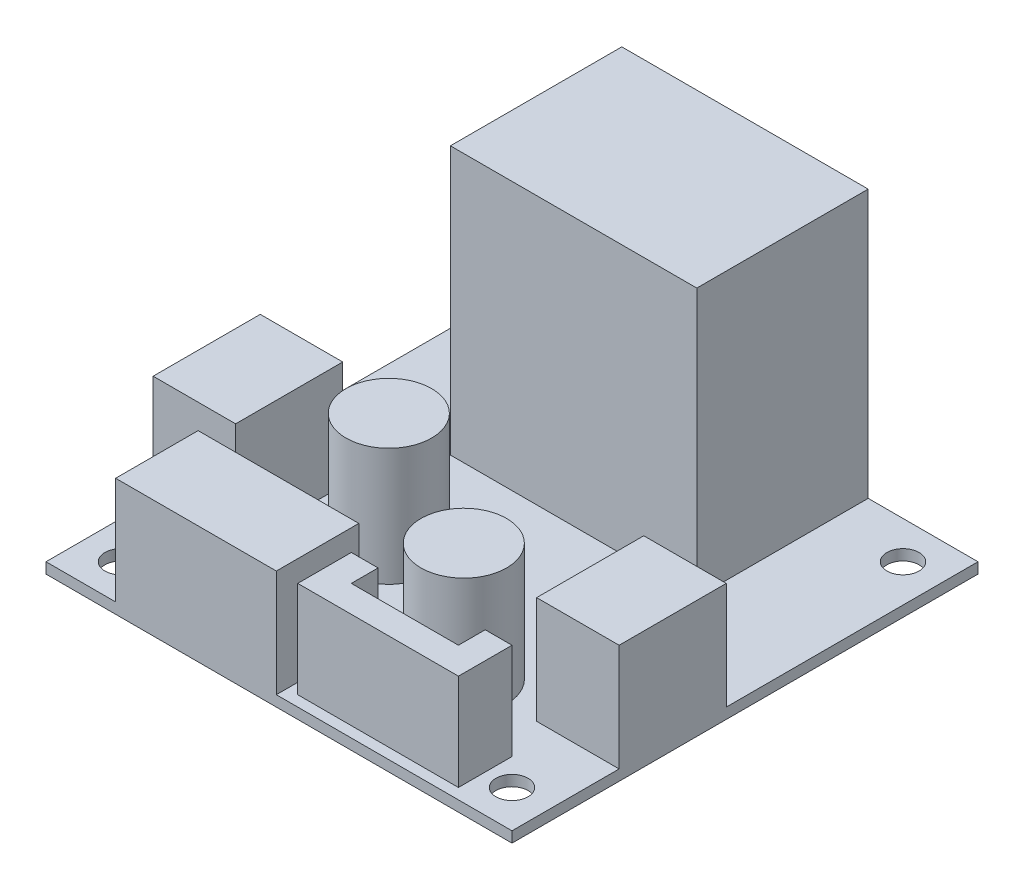
ISO-10303-21;
HEADER;
FILE_DESCRIPTION(('STEP AP214'),'2;1');
FILE_NAME('part.step','',(''),(''),'','','');
FILE_SCHEMA(('AUTOMOTIVE_DESIGN { 1 0 10303 214 1 1 1 1 }'));
ENDSEC;
DATA;
#1=APPLICATION_CONTEXT('core data for automotive mechanical design processes');
#2=APPLICATION_PROTOCOL_DEFINITION('international standard','automotive_design',2000,#1);
#3=PRODUCT_CONTEXT('',#1,'mechanical');
#4=PRODUCT('Part','Part','',(#3));
#5=PRODUCT_RELATED_PRODUCT_CATEGORY('part','',(#4));
#6=PRODUCT_DEFINITION_FORMATION('','',#4);
#7=PRODUCT_DEFINITION_CONTEXT('part definition',#1,'design');
#8=PRODUCT_DEFINITION('design','',#6,#7);
#9=PRODUCT_DEFINITION_SHAPE('','',#8);
#10=(LENGTH_UNIT() NAMED_UNIT(*) SI_UNIT(.MILLI.,.METRE.));
#11=(NAMED_UNIT(*) PLANE_ANGLE_UNIT() SI_UNIT($,.RADIAN.));
#12=(NAMED_UNIT(*) SI_UNIT($,.STERADIAN.) SOLID_ANGLE_UNIT());
#13=UNCERTAINTY_MEASURE_WITH_UNIT(LENGTH_MEASURE(1.E-05),#10,'distance_accuracy_value','');
#14=(GEOMETRIC_REPRESENTATION_CONTEXT(3) GLOBAL_UNCERTAINTY_ASSIGNED_CONTEXT((#13)) GLOBAL_UNIT_ASSIGNED_CONTEXT((#10,
#11,#12)) REPRESENTATION_CONTEXT('',''));
#15=CARTESIAN_POINT('',(0.,0.,0.));
#16=DIRECTION('',(0.,0.,1.));
#17=DIRECTION('',(1.,0.,0.));
#18=AXIS2_PLACEMENT_3D('',#15,#16,#17);
#19=CARTESIAN_POINT('',(0.,1.,0.));
#20=DIRECTION('',(0.,1.,0.));
#21=DIRECTION('',(0.,0.,1.));
#22=AXIS2_PLACEMENT_3D('',#19,#20,#21);
#23=PLANE('',#22);
#24=CARTESIAN_POINT('',(7.24999999999999,1.,11.75));
#25=DIRECTION('',(0.,1.,0.));
#26=DIRECTION('',(0.,0.,1.));
#27=AXIS2_PLACEMENT_3D('',#24,#25,#26);
#28=CIRCLE('',#27,4.);
#29=CARTESIAN_POINT('',(7.24999999999999,1.,15.75));
#30=VERTEX_POINT('',#29);
#31=EDGE_CURVE('E859',#30,#30,#28,.T.);
#32=ORIENTED_EDGE('',*,*,#31,.F.);
#33=EDGE_LOOP('',(#32));
#34=FACE_BOUND('',#33,.T.);
#35=CARTESIAN_POINT('',(-6.75000000000001,1.,4.75));
#36=DIRECTION('',(0.,1.,0.));
#37=DIRECTION('',(0.,0.,1.));
#38=AXIS2_PLACEMENT_3D('',#35,#36,#37);
#39=CIRCLE('',#38,4.);
#40=CARTESIAN_POINT('',(-6.75000000000001,1.,8.75));
#41=VERTEX_POINT('',#40);
#42=EDGE_CURVE('E858',#41,#41,#39,.T.);
#43=ORIENTED_EDGE('',*,*,#42,.F.);
#44=EDGE_LOOP('',(#43));
#45=FACE_BOUND('',#44,.T.);
#46=DIRECTION('',(-1.,0.,0.));
#47=VECTOR('',#46,1.);
#48=CARTESIAN_POINT('',(0.,1.,20.75));
#49=LINE('',#48,#47);
#50=CARTESIAN_POINT('',(15.75,1.,20.75));
#51=VERTEX_POINT('',#50);
#52=CARTESIAN_POINT('',(0.74999999999999,1.,20.75));
#53=VERTEX_POINT('',#52);
#54=EDGE_CURVE('E228',#51,#53,#49,.T.);
#55=ORIENTED_EDGE('',*,*,#54,.T.);
#56=DIRECTION('',(0.,0.,-1.));
#57=VECTOR('',#56,1.);
#58=CARTESIAN_POINT('',(0.74999999999999,1.,0.));
#59=LINE('',#58,#57);
#60=CARTESIAN_POINT('',(0.74999999999999,1.,15.75));
#61=VERTEX_POINT('',#60);
#62=EDGE_CURVE('E243',#53,#61,#59,.T.);
#63=ORIENTED_EDGE('',*,*,#62,.T.);
#64=DIRECTION('',(1.,0.,0.));
#65=VECTOR('',#64,1.);
#66=CARTESIAN_POINT('',(0.,1.,15.75));
#67=LINE('',#66,#65);
#68=CARTESIAN_POINT('',(3.24999999999999,1.,15.75));
#69=VERTEX_POINT('',#68);
#70=EDGE_CURVE('E275',#61,#69,#67,.T.);
#71=ORIENTED_EDGE('',*,*,#70,.T.);
#72=DIRECTION('',(0.,0.,1.));
#73=VECTOR('',#72,1.);
#74=CARTESIAN_POINT('',(3.24999999999999,1.,0.));
#75=LINE('',#74,#73);
#76=CARTESIAN_POINT('',(3.24999999999999,1.,18.25));
#77=VERTEX_POINT('',#76);
#78=EDGE_CURVE('E273',#69,#77,#75,.T.);
#79=ORIENTED_EDGE('',*,*,#78,.T.);
#80=DIRECTION('',(1.,0.,0.));
#81=VECTOR('',#80,1.);
#82=CARTESIAN_POINT('',(0.,1.,18.25));
#83=LINE('',#82,#81);
#84=CARTESIAN_POINT('',(13.25,1.,18.25));
#85=VERTEX_POINT('',#84);
#86=EDGE_CURVE('E271',#77,#85,#83,.T.);
#87=ORIENTED_EDGE('',*,*,#86,.T.);
#88=DIRECTION('',(0.,0.,-1.));
#89=VECTOR('',#88,1.);
#90=CARTESIAN_POINT('',(13.25,1.,0.));
#91=LINE('',#90,#89);
#92=CARTESIAN_POINT('',(13.25,1.,15.75));
#93=VERTEX_POINT('',#92);
#94=EDGE_CURVE('E269',#85,#93,#91,.T.);
#95=ORIENTED_EDGE('',*,*,#94,.T.);
#96=DIRECTION('',(1.,0.,0.));
#97=VECTOR('',#96,1.);
#98=CARTESIAN_POINT('',(0.,1.,15.75));
#99=LINE('',#98,#97);
#100=CARTESIAN_POINT('',(15.75,1.,15.75));
#101=VERTEX_POINT('',#100);
#102=EDGE_CURVE('E58',#93,#101,#99,.T.);
#103=ORIENTED_EDGE('',*,*,#102,.T.);
#104=DIRECTION('',(0.,0.,1.));
#105=VECTOR('',#104,1.);
#106=CARTESIAN_POINT('',(15.75,1.,0.));
#107=LINE('',#106,#105);
#108=EDGE_CURVE('E53',#101,#51,#107,.T.);
#109=ORIENTED_EDGE('',*,*,#108,.T.);
#110=EDGE_LOOP('',(#55,#63,#71,#79,#87,#95,#103,#109));
#111=FACE_BOUND('',#110,.T.);
#112=CARTESIAN_POINT('',(-18.25,1.,18.25));
#113=DIRECTION('',(0.,1.,0.));
#114=DIRECTION('',(0.,0.,1.));
#115=AXIS2_PLACEMENT_3D('',#112,#113,#114);
#116=CIRCLE('',#115,1.5);
#117=CARTESIAN_POINT('',(-18.25,1.,19.75));
#118=VERTEX_POINT('',#117);
#119=EDGE_CURVE('E408',#118,#118,#116,.T.);
#120=ORIENTED_EDGE('',*,*,#119,.F.);
#121=EDGE_LOOP('',(#120));
#122=FACE_BOUND('',#121,.T.);
#123=CARTESIAN_POINT('',(18.25,1.,18.25));
#124=DIRECTION('',(0.,1.,0.));
#125=DIRECTION('',(0.,0.,1.));
#126=AXIS2_PLACEMENT_3D('',#123,#124,#125);
#127=CIRCLE('',#126,1.5);
#128=CARTESIAN_POINT('',(18.25,1.,19.75));
#129=VERTEX_POINT('',#128);
#130=EDGE_CURVE('E407',#129,#129,#127,.T.);
#131=ORIENTED_EDGE('',*,*,#130,.F.);
#132=EDGE_LOOP('',(#131));
#133=FACE_BOUND('',#132,.T.);
#134=CARTESIAN_POINT('',(18.25,1.,-18.25));
#135=DIRECTION('',(0.,1.,0.));
#136=DIRECTION('',(0.,0.,1.));
#137=AXIS2_PLACEMENT_3D('',#134,#135,#136);
#138=CIRCLE('',#137,1.5);
#139=CARTESIAN_POINT('',(18.25,1.,-16.75));
#140=VERTEX_POINT('',#139);
#141=EDGE_CURVE('E415',#140,#140,#138,.T.);
#142=ORIENTED_EDGE('',*,*,#141,.F.);
#143=EDGE_LOOP('',(#142));
#144=FACE_BOUND('',#143,.T.);
#145=CARTESIAN_POINT('',(-18.25,1.,-18.25));
#146=DIRECTION('',(0.,1.,0.));
#147=DIRECTION('',(0.,0.,1.));
#148=AXIS2_PLACEMENT_3D('',#145,#146,#147);
#149=CIRCLE('',#148,1.5);
#150=CARTESIAN_POINT('',(-18.25,1.,-16.75));
#151=VERTEX_POINT('',#150);
#152=EDGE_CURVE('E421',#151,#151,#149,.T.);
#153=ORIENTED_EDGE('',*,*,#152,.F.);
#154=EDGE_LOOP('',(#153));
#155=FACE_BOUND('',#154,.T.);
#156=DIRECTION('',(1.,0.,0.));
#157=VECTOR('',#156,1.);
#158=CARTESIAN_POINT('',(0.,1.,14.05));
#159=LINE('',#158,#157);
#160=CARTESIAN_POINT('',(-15.25,1.,14.05));
#161=VERTEX_POINT('',#160);
#162=CARTESIAN_POINT('',(-0.250000000000011,1.,14.05));
#163=VERTEX_POINT('',#162);
#164=EDGE_CURVE('E310',#161,#163,#159,.T.);
#165=ORIENTED_EDGE('',*,*,#164,.T.);
#166=DIRECTION('',(0.,0.,-1.));
#167=VECTOR('',#166,1.);
#168=CARTESIAN_POINT('',(-0.250000000000011,1.,0.));
#169=LINE('',#168,#167);
#170=CARTESIAN_POINT('',(-0.250000000000011,1.,21.75));
#171=VERTEX_POINT('',#170);
#172=EDGE_CURVE('E231',#171,#163,#169,.T.);
#173=ORIENTED_EDGE('',*,*,#172,.F.);
#174=DIRECTION('',(1.,0.,0.));
#175=VECTOR('',#174,1.);
#176=CARTESIAN_POINT('',(-21.75,1.,21.75));
#177=LINE('',#176,#175);
#178=CARTESIAN_POINT('',(21.75,1.,21.75));
#179=VERTEX_POINT('',#178);
#180=EDGE_CURVE('E461',#171,#179,#177,.T.);
#181=ORIENTED_EDGE('',*,*,#180,.T.);
#182=DIRECTION('',(0.,0.,-1.));
#183=VECTOR('',#182,1.);
#184=CARTESIAN_POINT('',(21.75,1.,-21.75));
#185=LINE('',#184,#183);
#186=CARTESIAN_POINT('',(21.75,1.,11.75));
#187=VERTEX_POINT('',#186);
#188=EDGE_CURVE('E430',#179,#187,#185,.T.);
#189=ORIENTED_EDGE('',*,*,#188,.T.);
#190=DIRECTION('',(-1.,0.,0.));
#191=VECTOR('',#190,1.);
#192=CARTESIAN_POINT('',(0.,1.,11.75));
#193=LINE('',#192,#191);
#194=CARTESIAN_POINT('',(14.05,1.,11.75));
#195=VERTEX_POINT('',#194);
#196=EDGE_CURVE('E329',#187,#195,#193,.T.);
#197=ORIENTED_EDGE('',*,*,#196,.T.);
#198=DIRECTION('',(0.,0.,1.));
#199=VECTOR('',#198,1.);
#200=CARTESIAN_POINT('',(14.05,1.,0.));
#201=LINE('',#200,#199);
#202=CARTESIAN_POINT('',(14.05,1.,1.75000000000001));
#203=VERTEX_POINT('',#202);
#204=EDGE_CURVE('E339',#203,#195,#201,.T.);
#205=ORIENTED_EDGE('',*,*,#204,.F.);
#206=DIRECTION('',(-1.,0.,0.));
#207=VECTOR('',#206,1.);
#208=CARTESIAN_POINT('',(0.,1.,1.75000000000001));
#209=LINE('',#208,#207);
#210=CARTESIAN_POINT('',(21.75,1.,1.75000000000001));
#211=VERTEX_POINT('',#210);
#212=EDGE_CURVE('E324',#211,#203,#209,.T.);
#213=ORIENTED_EDGE('',*,*,#212,.F.);
#214=CARTESIAN_POINT('',(21.75,1.,-21.75));
#215=VERTEX_POINT('',#214);
#216=EDGE_CURVE('E433',#211,#215,#185,.T.);
#217=ORIENTED_EDGE('',*,*,#216,.T.);
#218=DIRECTION('',(-1.,0.,0.));
#219=VECTOR('',#218,1.);
#220=CARTESIAN_POINT('',(-21.75,1.,-21.75));
#221=LINE('',#220,#219);
#222=CARTESIAN_POINT('',(11.5,1.,-21.75));
#223=VERTEX_POINT('',#222);
#224=EDGE_CURVE('E442',#215,#223,#221,.T.);
#225=ORIENTED_EDGE('',*,*,#224,.T.);
#226=DIRECTION('',(0.,0.,1.));
#227=VECTOR('',#226,1.);
#228=CARTESIAN_POINT('',(11.5,1.,0.));
#229=LINE('',#228,#227);
#230=CARTESIAN_POINT('',(11.5,1.,-5.75000000000001));
#231=VERTEX_POINT('',#230);
#232=EDGE_CURVE('E39',#223,#231,#229,.T.);
#233=ORIENTED_EDGE('',*,*,#232,.T.);
#234=DIRECTION('',(1.,0.,0.));
#235=VECTOR('',#234,1.);
#236=CARTESIAN_POINT('',(0.,1.,-5.75));
#237=LINE('',#236,#235);
#238=CARTESIAN_POINT('',(-11.5,1.,-5.75));
#239=VERTEX_POINT('',#238);
#240=EDGE_CURVE('E387',#239,#231,#237,.T.);
#241=ORIENTED_EDGE('',*,*,#240,.F.);
#242=DIRECTION('',(0.,0.,1.));
#243=VECTOR('',#242,1.);
#244=CARTESIAN_POINT('',(-11.5,1.,0.));
#245=LINE('',#244,#243);
#246=CARTESIAN_POINT('',(-11.5,1.,-21.75));
#247=VERTEX_POINT('',#246);
#248=EDGE_CURVE('E397',#247,#239,#245,.T.);
#249=ORIENTED_EDGE('',*,*,#248,.F.);
#250=CARTESIAN_POINT('',(-21.75,1.,-21.75));
#251=VERTEX_POINT('',#250);
#252=EDGE_CURVE('E432',#247,#251,#221,.T.);
#253=ORIENTED_EDGE('',*,*,#252,.T.);
#254=DIRECTION('',(0.,0.,1.));
#255=VECTOR('',#254,1.);
#256=CARTESIAN_POINT('',(-21.75,1.,-21.75));
#257=LINE('',#256,#255);
#258=CARTESIAN_POINT('',(-21.75,1.,1.75000000000001));
#259=VERTEX_POINT('',#258);
#260=EDGE_CURVE('E436',#251,#259,#257,.T.);
#261=ORIENTED_EDGE('',*,*,#260,.T.);
#262=DIRECTION('',(1.,0.,0.));
#263=VECTOR('',#262,1.);
#264=CARTESIAN_POINT('',(0.,1.,1.75000000000001));
#265=LINE('',#264,#263);
#266=CARTESIAN_POINT('',(-14.05,1.,1.75000000000001));
#267=VERTEX_POINT('',#266);
#268=EDGE_CURVE('E368',#259,#267,#265,.T.);
#269=ORIENTED_EDGE('',*,*,#268,.T.);
#270=DIRECTION('',(0.,0.,1.));
#271=VECTOR('',#270,1.);
#272=CARTESIAN_POINT('',(-14.05,1.,0.));
#273=LINE('',#272,#271);
#274=CARTESIAN_POINT('',(-14.05,1.,11.75));
#275=VERTEX_POINT('',#274);
#276=EDGE_CURVE('E354',#267,#275,#273,.T.);
#277=ORIENTED_EDGE('',*,*,#276,.T.);
#278=DIRECTION('',(1.,0.,0.));
#279=VECTOR('',#278,1.);
#280=CARTESIAN_POINT('',(0.,1.,11.75));
#281=LINE('',#280,#279);
#282=CARTESIAN_POINT('',(-21.75,1.,11.75));
#283=VERTEX_POINT('',#282);
#284=EDGE_CURVE('E359',#283,#275,#281,.T.);
#285=ORIENTED_EDGE('',*,*,#284,.F.);
#286=CARTESIAN_POINT('',(-21.75,1.,21.75));
#287=VERTEX_POINT('',#286);
#288=EDGE_CURVE('E443',#283,#287,#257,.T.);
#289=ORIENTED_EDGE('',*,*,#288,.T.);
#290=CARTESIAN_POINT('',(-15.25,1.,21.75));
#291=VERTEX_POINT('',#290);
#292=EDGE_CURVE('E453',#287,#291,#177,.T.);
#293=ORIENTED_EDGE('',*,*,#292,.T.);
#294=DIRECTION('',(0.,0.,-1.));
#295=VECTOR('',#294,1.);
#296=CARTESIAN_POINT('',(-15.25,1.,0.));
#297=LINE('',#296,#295);
#298=EDGE_CURVE('E299',#291,#161,#297,.T.);
#299=ORIENTED_EDGE('',*,*,#298,.T.);
#300=EDGE_LOOP('',(#165,#173,#181,#189,#197,#205,#213,#217,#225,#233,#241,#249,#253,#261,#269,
#277,#285,#289,#293,#299));
#301=FACE_BOUND('',#300,.T.);
#302=ADVANCED_FACE('F35',(#34,#45,#111,#122,#133,#144,#155,#301),#23,.T.);
#303=CARTESIAN_POINT('',(21.75,1.,-21.75));
#304=DIRECTION('',(-1.,0.,0.));
#305=DIRECTION('',(0.,0.,1.));
#306=AXIS2_PLACEMENT_3D('',#303,#304,#305);
#307=PLANE('',#306);
#308=DIRECTION('',(0.,0.,-1.));
#309=VECTOR('',#308,1.);
#310=CARTESIAN_POINT('',(21.75,0.,-21.75));
#311=LINE('',#310,#309);
#312=CARTESIAN_POINT('',(21.75,0.,21.75));
#313=VERTEX_POINT('',#312);
#314=CARTESIAN_POINT('',(21.75,0.,-21.75));
#315=VERTEX_POINT('',#314);
#316=EDGE_CURVE('E427',#313,#315,#311,.T.);
#317=ORIENTED_EDGE('',*,*,#316,.T.);
#318=DIRECTION('',(0.,-1.,0.));
#319=VECTOR('',#318,1.);
#320=CARTESIAN_POINT('',(21.75,1.,-21.75));
#321=LINE('',#320,#319);
#322=EDGE_CURVE('E11',#215,#315,#321,.T.);
#323=ORIENTED_EDGE('',*,*,#322,.F.);
#324=ORIENTED_EDGE('',*,*,#216,.F.);
#325=DIRECTION('',(0.,-1.,0.));
#326=VECTOR('',#325,1.);
#327=CARTESIAN_POINT('',(21.75,11.,1.75000000000001));
#328=LINE('',#327,#326);
#329=CARTESIAN_POINT('',(21.75,11.,1.75000000000001));
#330=VERTEX_POINT('',#329);
#331=EDGE_CURVE('E336',#330,#211,#328,.T.);
#332=ORIENTED_EDGE('',*,*,#331,.F.);
#333=DIRECTION('',(0.,0.,-1.));
#334=VECTOR('',#333,1.);
#335=CARTESIAN_POINT('',(21.75,11.,0.));
#336=LINE('',#335,#334);
#337=CARTESIAN_POINT('',(21.75,11.,11.75));
#338=VERTEX_POINT('',#337);
#339=EDGE_CURVE('E334',#338,#330,#336,.T.);
#340=ORIENTED_EDGE('',*,*,#339,.F.);
#341=DIRECTION('',(0.,-1.,0.));
#342=VECTOR('',#341,1.);
#343=CARTESIAN_POINT('',(21.75,11.,11.75));
#344=LINE('',#343,#342);
#345=EDGE_CURVE('E345',#338,#187,#344,.T.);
#346=ORIENTED_EDGE('',*,*,#345,.T.);
#347=ORIENTED_EDGE('',*,*,#188,.F.);
#348=DIRECTION('',(0.,-1.,0.));
#349=VECTOR('',#348,1.);
#350=CARTESIAN_POINT('',(21.75,1.,21.75));
#351=LINE('',#350,#349);
#352=EDGE_CURVE('E450',#179,#313,#351,.T.);
#353=ORIENTED_EDGE('',*,*,#352,.T.);
#354=EDGE_LOOP('',(#317,#323,#324,#332,#340,#346,#347,#353));
#355=FACE_BOUND('',#354,.T.);
#356=ADVANCED_FACE('F37',(#355),#307,.F.);
#357=CARTESIAN_POINT('',(-21.75,1.,-21.75));
#358=DIRECTION('',(0.,0.,1.));
#359=DIRECTION('',(1.,0.,0.));
#360=AXIS2_PLACEMENT_3D('',#357,#358,#359);
#361=PLANE('',#360);
#362=DIRECTION('',(-1.,0.,0.));
#363=VECTOR('',#362,1.);
#364=CARTESIAN_POINT('',(-21.75,0.,-21.75));
#365=LINE('',#364,#363);
#366=CARTESIAN_POINT('',(-21.75,0.,-21.75));
#367=VERTEX_POINT('',#366);
#368=EDGE_CURVE('E458',#315,#367,#365,.T.);
#369=ORIENTED_EDGE('',*,*,#368,.T.);
#370=DIRECTION('',(0.,-1.,0.));
#371=VECTOR('',#370,1.);
#372=CARTESIAN_POINT('',(-21.75,1.,-21.75));
#373=LINE('',#372,#371);
#374=EDGE_CURVE('E45',#251,#367,#373,.T.);
#375=ORIENTED_EDGE('',*,*,#374,.F.);
#376=ORIENTED_EDGE('',*,*,#252,.F.);
#377=DIRECTION('',(0.,-1.,0.));
#378=VECTOR('',#377,1.);
#379=CARTESIAN_POINT('',(-11.5,26.,-21.75));
#380=LINE('',#379,#378);
#381=CARTESIAN_POINT('',(-11.5,26.,-21.75));
#382=VERTEX_POINT('',#381);
#383=EDGE_CURVE('E403',#382,#247,#380,.T.);
#384=ORIENTED_EDGE('',*,*,#383,.F.);
#385=DIRECTION('',(-1.,0.,0.));
#386=VECTOR('',#385,1.);
#387=CARTESIAN_POINT('',(0.,26.,-21.75));
#388=LINE('',#387,#386);
#389=CARTESIAN_POINT('',(11.5,26.,-21.75));
#390=VERTEX_POINT('',#389);
#391=EDGE_CURVE('E386',#390,#382,#388,.T.);
#392=ORIENTED_EDGE('',*,*,#391,.F.);
#393=DIRECTION('',(0.,-1.,0.));
#394=VECTOR('',#393,1.);
#395=CARTESIAN_POINT('',(11.5,26.,-21.75));
#396=LINE('',#395,#394);
#397=EDGE_CURVE('E411',#390,#223,#396,.T.);
#398=ORIENTED_EDGE('',*,*,#397,.T.);
#399=ORIENTED_EDGE('',*,*,#224,.F.);
#400=ORIENTED_EDGE('',*,*,#322,.T.);
#401=EDGE_LOOP('',(#369,#375,#376,#384,#392,#398,#399,#400));
#402=FACE_BOUND('',#401,.T.);
#403=ADVANCED_FACE('F510',(#402),#361,.F.);
#404=CARTESIAN_POINT('',(-21.75,1.,-21.75));
#405=DIRECTION('',(1.,0.,0.));
#406=DIRECTION('',(0.,0.,-1.));
#407=AXIS2_PLACEMENT_3D('',#404,#405,#406);
#408=PLANE('',#407);
#409=DIRECTION('',(0.,0.,1.));
#410=VECTOR('',#409,1.);
#411=CARTESIAN_POINT('',(-21.75,0.,-21.75));
#412=LINE('',#411,#410);
#413=CARTESIAN_POINT('',(-21.75,0.,21.75));
#414=VERTEX_POINT('',#413);
#415=EDGE_CURVE('E456',#367,#414,#412,.T.);
#416=ORIENTED_EDGE('',*,*,#415,.T.);
#417=DIRECTION('',(0.,-1.,0.));
#418=VECTOR('',#417,1.);
#419=CARTESIAN_POINT('',(-21.75,1.,21.75));
#420=LINE('',#419,#418);
#421=EDGE_CURVE('E447',#287,#414,#420,.T.);
#422=ORIENTED_EDGE('',*,*,#421,.F.);
#423=ORIENTED_EDGE('',*,*,#288,.F.);
#424=DIRECTION('',(0.,-1.,0.));
#425=VECTOR('',#424,1.);
#426=CARTESIAN_POINT('',(-21.75,11.,11.75));
#427=LINE('',#426,#425);
#428=CARTESIAN_POINT('',(-21.75,11.,11.75));
#429=VERTEX_POINT('',#428);
#430=EDGE_CURVE('E374',#429,#283,#427,.T.);
#431=ORIENTED_EDGE('',*,*,#430,.F.);
#432=DIRECTION('',(0.,0.,1.));
#433=VECTOR('',#432,1.);
#434=CARTESIAN_POINT('',(-21.75,11.,0.));
#435=LINE('',#434,#433);
#436=CARTESIAN_POINT('',(-21.75,11.,1.75000000000001));
#437=VERTEX_POINT('',#436);
#438=EDGE_CURVE('E362',#437,#429,#435,.T.);
#439=ORIENTED_EDGE('',*,*,#438,.F.);
#440=DIRECTION('',(0.,-1.,0.));
#441=VECTOR('',#440,1.);
#442=CARTESIAN_POINT('',(-21.75,11.,1.75000000000001));
#443=LINE('',#442,#441);
#444=EDGE_CURVE('E377',#437,#259,#443,.T.);
#445=ORIENTED_EDGE('',*,*,#444,.T.);
#446=ORIENTED_EDGE('',*,*,#260,.F.);
#447=ORIENTED_EDGE('',*,*,#374,.T.);
#448=EDGE_LOOP('',(#416,#422,#423,#431,#439,#445,#446,#447));
#449=FACE_BOUND('',#448,.T.);
#450=ADVANCED_FACE('F471',(#449),#408,.F.);
#451=CARTESIAN_POINT('',(-21.75,1.,21.75));
#452=DIRECTION('',(0.,0.,-1.));
#453=DIRECTION('',(-1.,0.,0.));
#454=AXIS2_PLACEMENT_3D('',#451,#452,#453);
#455=PLANE('',#454);
#456=DIRECTION('',(1.,0.,0.));
#457=VECTOR('',#456,1.);
#458=CARTESIAN_POINT('',(-21.75,0.,21.75));
#459=LINE('',#458,#457);
#460=EDGE_CURVE('E454',#414,#313,#459,.T.);
#461=ORIENTED_EDGE('',*,*,#460,.T.);
#462=ORIENTED_EDGE('',*,*,#352,.F.);
#463=ORIENTED_EDGE('',*,*,#180,.F.);
#464=DIRECTION('',(0.,-1.,0.));
#465=VECTOR('',#464,1.);
#466=CARTESIAN_POINT('',(-0.250000000000011,11.,21.75));
#467=LINE('',#466,#465);
#468=CARTESIAN_POINT('',(-0.250000000000011,11.,21.75));
#469=VERTEX_POINT('',#468);
#470=EDGE_CURVE('E321',#469,#171,#467,.T.);
#471=ORIENTED_EDGE('',*,*,#470,.F.);
#472=DIRECTION('',(1.,0.,0.));
#473=VECTOR('',#472,1.);
#474=CARTESIAN_POINT('',(0.,11.,21.75));
#475=LINE('',#474,#473);
#476=CARTESIAN_POINT('',(-15.25,11.,21.75));
#477=VERTEX_POINT('',#476);
#478=EDGE_CURVE('E295',#477,#469,#475,.T.);
#479=ORIENTED_EDGE('',*,*,#478,.F.);
#480=DIRECTION('',(0.,-1.,0.));
#481=VECTOR('',#480,1.);
#482=CARTESIAN_POINT('',(-15.25,11.,21.75));
#483=LINE('',#482,#481);
#484=EDGE_CURVE('E307',#477,#291,#483,.T.);
#485=ORIENTED_EDGE('',*,*,#484,.T.);
#486=ORIENTED_EDGE('',*,*,#292,.F.);
#487=ORIENTED_EDGE('',*,*,#421,.T.);
#488=EDGE_LOOP('',(#461,#462,#463,#471,#479,#485,#486,#487));
#489=FACE_BOUND('',#488,.T.);
#490=ADVANCED_FACE('F475',(#489),#455,.F.);
#491=CARTESIAN_POINT('',(0.,0.,0.));
#492=DIRECTION('',(0.,1.,0.));
#493=DIRECTION('',(0.,0.,1.));
#494=AXIS2_PLACEMENT_3D('',#491,#492,#493);
#495=PLANE('',#494);
#496=CARTESIAN_POINT('',(-18.25,0.,18.25));
#497=DIRECTION('',(0.,1.,0.));
#498=DIRECTION('',(0.,0.,1.));
#499=AXIS2_PLACEMENT_3D('',#496,#497,#498);
#500=CIRCLE('',#499,1.5);
#501=CARTESIAN_POINT('',(-18.25,0.,19.75));
#502=VERTEX_POINT('',#501);
#503=EDGE_CURVE('E404',#502,#502,#500,.T.);
#504=ORIENTED_EDGE('',*,*,#503,.T.);
#505=EDGE_LOOP('',(#504));
#506=FACE_BOUND('',#505,.T.);
#507=CARTESIAN_POINT('',(18.25,0.,18.25));
#508=DIRECTION('',(0.,1.,0.));
#509=DIRECTION('',(0.,0.,1.));
#510=AXIS2_PLACEMENT_3D('',#507,#508,#509);
#511=CIRCLE('',#510,1.5);
#512=CARTESIAN_POINT('',(18.25,0.,19.75));
#513=VERTEX_POINT('',#512);
#514=EDGE_CURVE('E412',#513,#513,#511,.T.);
#515=ORIENTED_EDGE('',*,*,#514,.T.);
#516=EDGE_LOOP('',(#515));
#517=FACE_BOUND('',#516,.T.);
#518=CARTESIAN_POINT('',(18.25,0.,-18.25));
#519=DIRECTION('',(0.,1.,0.));
#520=DIRECTION('',(0.,0.,1.));
#521=AXIS2_PLACEMENT_3D('',#518,#519,#520);
#522=CIRCLE('',#521,1.5);
#523=CARTESIAN_POINT('',(18.25,0.,-16.75));
#524=VERTEX_POINT('',#523);
#525=EDGE_CURVE('E418',#524,#524,#522,.T.);
#526=ORIENTED_EDGE('',*,*,#525,.T.);
#527=EDGE_LOOP('',(#526));
#528=FACE_BOUND('',#527,.T.);
#529=CARTESIAN_POINT('',(-18.25,0.,-18.25));
#530=DIRECTION('',(0.,1.,0.));
#531=DIRECTION('',(0.,0.,1.));
#532=AXIS2_PLACEMENT_3D('',#529,#530,#531);
#533=CIRCLE('',#532,1.5);
#534=CARTESIAN_POINT('',(-18.25,0.,-16.75));
#535=VERTEX_POINT('',#534);
#536=EDGE_CURVE('E424',#535,#535,#533,.T.);
#537=ORIENTED_EDGE('',*,*,#536,.T.);
#538=EDGE_LOOP('',(#537));
#539=FACE_BOUND('',#538,.T.);
#540=ORIENTED_EDGE('',*,*,#316,.F.);
#541=ORIENTED_EDGE('',*,*,#460,.F.);
#542=ORIENTED_EDGE('',*,*,#415,.F.);
#543=ORIENTED_EDGE('',*,*,#368,.F.);
#544=EDGE_LOOP('',(#540,#541,#542,#543));
#545=FACE_BOUND('',#544,.T.);
#546=ADVANCED_FACE('F514',(#506,#517,#528,#539,#545),#495,.F.);
#547=CARTESIAN_POINT('',(-18.25,0.,-18.25));
#548=DIRECTION('',(0.,1.,0.));
#549=DIRECTION('',(0.,0.,1.));
#550=AXIS2_PLACEMENT_3D('',#547,#548,#549);
#551=CYLINDRICAL_SURFACE('',#550,1.5);
#552=ORIENTED_EDGE('',*,*,#536,.F.);
#553=EDGE_LOOP('',(#552));
#554=FACE_BOUND('',#553,.T.);
#555=ORIENTED_EDGE('',*,*,#152,.T.);
#556=EDGE_LOOP('',(#555));
#557=FACE_BOUND('',#556,.T.);
#558=ADVANCED_FACE('F550',(#554,#557),#551,.F.);
#559=CARTESIAN_POINT('',(18.25,0.,-18.25));
#560=DIRECTION('',(0.,1.,0.));
#561=DIRECTION('',(0.,0.,1.));
#562=AXIS2_PLACEMENT_3D('',#559,#560,#561);
#563=CYLINDRICAL_SURFACE('',#562,1.5);
#564=ORIENTED_EDGE('',*,*,#525,.F.);
#565=EDGE_LOOP('',(#564));
#566=FACE_BOUND('',#565,.T.);
#567=ORIENTED_EDGE('',*,*,#141,.T.);
#568=EDGE_LOOP('',(#567));
#569=FACE_BOUND('',#568,.T.);
#570=ADVANCED_FACE('F584',(#566,#569),#563,.F.);
#571=CARTESIAN_POINT('',(18.25,0.,18.25));
#572=DIRECTION('',(0.,1.,0.));
#573=DIRECTION('',(0.,0.,1.));
#574=AXIS2_PLACEMENT_3D('',#571,#572,#573);
#575=CYLINDRICAL_SURFACE('',#574,1.5);
#576=ORIENTED_EDGE('',*,*,#514,.F.);
#577=EDGE_LOOP('',(#576));
#578=FACE_BOUND('',#577,.T.);
#579=ORIENTED_EDGE('',*,*,#130,.T.);
#580=EDGE_LOOP('',(#579));
#581=FACE_BOUND('',#580,.T.);
#582=ADVANCED_FACE('F591',(#578,#581),#575,.F.);
#583=CARTESIAN_POINT('',(-18.25,0.,18.25));
#584=DIRECTION('',(0.,1.,0.));
#585=DIRECTION('',(0.,0.,1.));
#586=AXIS2_PLACEMENT_3D('',#583,#584,#585);
#587=CYLINDRICAL_SURFACE('',#586,1.5);
#588=ORIENTED_EDGE('',*,*,#503,.F.);
#589=EDGE_LOOP('',(#588));
#590=FACE_BOUND('',#589,.T.);
#591=ORIENTED_EDGE('',*,*,#119,.T.);
#592=EDGE_LOOP('',(#591));
#593=FACE_BOUND('',#592,.T.);
#594=ADVANCED_FACE('F598',(#590,#593),#587,.F.);
#595=CARTESIAN_POINT('',(11.5,26.,0.));
#596=DIRECTION('',(1.,0.,0.));
#597=DIRECTION('',(0.,0.,-1.));
#598=AXIS2_PLACEMENT_3D('',#595,#596,#597);
#599=PLANE('',#598);
#600=ORIENTED_EDGE('',*,*,#232,.F.);
#601=ORIENTED_EDGE('',*,*,#397,.F.);
#602=DIRECTION('',(0.,0.,1.));
#603=VECTOR('',#602,1.);
#604=CARTESIAN_POINT('',(11.5,26.,0.));
#605=LINE('',#604,#603);
#606=CARTESIAN_POINT('',(11.5,26.,-5.75000000000001));
#607=VERTEX_POINT('',#606);
#608=EDGE_CURVE('E383',#390,#607,#605,.T.);
#609=ORIENTED_EDGE('',*,*,#608,.T.);
#610=DIRECTION('',(0.,-1.,0.));
#611=VECTOR('',#610,1.);
#612=CARTESIAN_POINT('',(11.5,26.,-5.75000000000001));
#613=LINE('',#612,#611);
#614=EDGE_CURVE('E392',#607,#231,#613,.T.);
#615=ORIENTED_EDGE('',*,*,#614,.T.);
#616=EDGE_LOOP('',(#600,#601,#609,#615));
#617=FACE_BOUND('',#616,.T.);
#618=ADVANCED_FACE('F605',(#617),#599,.T.);
#619=CARTESIAN_POINT('',(-11.5,26.,0.));
#620=DIRECTION('',(1.,0.,0.));
#621=DIRECTION('',(0.,0.,-1.));
#622=AXIS2_PLACEMENT_3D('',#619,#620,#621);
#623=PLANE('',#622);
#624=ORIENTED_EDGE('',*,*,#248,.T.);
#625=DIRECTION('',(0.,-1.,0.));
#626=VECTOR('',#625,1.);
#627=CARTESIAN_POINT('',(-11.5,26.,-5.75));
#628=LINE('',#627,#626);
#629=CARTESIAN_POINT('',(-11.5,26.,-5.75));
#630=VERTEX_POINT('',#629);
#631=EDGE_CURVE('E400',#630,#239,#628,.T.);
#632=ORIENTED_EDGE('',*,*,#631,.F.);
#633=DIRECTION('',(0.,0.,1.));
#634=VECTOR('',#633,1.);
#635=CARTESIAN_POINT('',(-11.5,26.,0.));
#636=LINE('',#635,#634);
#637=EDGE_CURVE('E389',#382,#630,#636,.T.);
#638=ORIENTED_EDGE('',*,*,#637,.F.);
#639=ORIENTED_EDGE('',*,*,#383,.T.);
#640=EDGE_LOOP('',(#624,#632,#638,#639));
#641=FACE_BOUND('',#640,.T.);
#642=ADVANCED_FACE('F612',(#641),#623,.F.);
#643=CARTESIAN_POINT('',(0.,26.,-5.75));
#644=DIRECTION('',(0.,0.,-1.));
#645=DIRECTION('',(-1.,0.,0.));
#646=AXIS2_PLACEMENT_3D('',#643,#644,#645);
#647=PLANE('',#646);
#648=ORIENTED_EDGE('',*,*,#240,.T.);
#649=ORIENTED_EDGE('',*,*,#614,.F.);
#650=DIRECTION('',(1.,0.,0.));
#651=VECTOR('',#650,1.);
#652=CARTESIAN_POINT('',(0.,26.,-5.75));
#653=LINE('',#652,#651);
#654=EDGE_CURVE('E391',#630,#607,#653,.T.);
#655=ORIENTED_EDGE('',*,*,#654,.F.);
#656=ORIENTED_EDGE('',*,*,#631,.T.);
#657=EDGE_LOOP('',(#648,#649,#655,#656));
#658=FACE_BOUND('',#657,.T.);
#659=ADVANCED_FACE('F620',(#658),#647,.F.);
#660=CARTESIAN_POINT('',(0.,26.,0.));
#661=DIRECTION('',(0.,1.,0.));
#662=DIRECTION('',(0.,0.,1.));
#663=AXIS2_PLACEMENT_3D('',#660,#661,#662);
#664=PLANE('',#663);
#665=ORIENTED_EDGE('',*,*,#608,.F.);
#666=ORIENTED_EDGE('',*,*,#391,.T.);
#667=ORIENTED_EDGE('',*,*,#637,.T.);
#668=ORIENTED_EDGE('',*,*,#654,.T.);
#669=EDGE_LOOP('',(#665,#666,#667,#668));
#670=FACE_BOUND('',#669,.T.);
#671=ADVANCED_FACE('F628',(#670),#664,.T.);
#672=CARTESIAN_POINT('',(-14.05,11.,0.));
#673=DIRECTION('',(1.,0.,0.));
#674=DIRECTION('',(0.,0.,-1.));
#675=AXIS2_PLACEMENT_3D('',#672,#673,#674);
#676=PLANE('',#675);
#677=ORIENTED_EDGE('',*,*,#276,.F.);
#678=DIRECTION('',(0.,-1.,0.));
#679=VECTOR('',#678,1.);
#680=CARTESIAN_POINT('',(-14.05,11.,1.75000000000001));
#681=LINE('',#680,#679);
#682=CARTESIAN_POINT('',(-14.05,11.,1.75000000000001));
#683=VERTEX_POINT('',#682);
#684=EDGE_CURVE('E380',#683,#267,#681,.T.);
#685=ORIENTED_EDGE('',*,*,#684,.F.);
#686=DIRECTION('',(0.,0.,1.));
#687=VECTOR('',#686,1.);
#688=CARTESIAN_POINT('',(-14.05,11.,0.));
#689=LINE('',#688,#687);
#690=CARTESIAN_POINT('',(-14.05,11.,11.75));
#691=VERTEX_POINT('',#690);
#692=EDGE_CURVE('E355',#683,#691,#689,.T.);
#693=ORIENTED_EDGE('',*,*,#692,.T.);
#694=DIRECTION('',(0.,-1.,0.));
#695=VECTOR('',#694,1.);
#696=CARTESIAN_POINT('',(-14.05,11.,11.75));
#697=LINE('',#696,#695);
#698=EDGE_CURVE('E366',#691,#275,#697,.T.);
#699=ORIENTED_EDGE('',*,*,#698,.T.);
#700=EDGE_LOOP('',(#677,#685,#693,#699));
#701=FACE_BOUND('',#700,.T.);
#702=ADVANCED_FACE('F525',(#701),#676,.T.);
#703=CARTESIAN_POINT('',(0.,11.,1.75000000000001));
#704=DIRECTION('',(0.,0.,-1.));
#705=DIRECTION('',(-1.,0.,0.));
#706=AXIS2_PLACEMENT_3D('',#703,#704,#705);
#707=PLANE('',#706);
#708=ORIENTED_EDGE('',*,*,#268,.F.);
#709=ORIENTED_EDGE('',*,*,#444,.F.);
#710=DIRECTION('',(1.,0.,0.));
#711=VECTOR('',#710,1.);
#712=CARTESIAN_POINT('',(0.,11.,1.75000000000001));
#713=LINE('',#712,#711);
#714=EDGE_CURVE('E358',#437,#683,#713,.T.);
#715=ORIENTED_EDGE('',*,*,#714,.T.);
#716=ORIENTED_EDGE('',*,*,#684,.T.);
#717=EDGE_LOOP('',(#708,#709,#715,#716));
#718=FACE_BOUND('',#717,.T.);
#719=ADVANCED_FACE('F521',(#718),#707,.T.);
#720=CARTESIAN_POINT('',(0.,11.,11.75));
#721=DIRECTION('',(0.,0.,-1.));
#722=DIRECTION('',(-1.,0.,0.));
#723=AXIS2_PLACEMENT_3D('',#720,#721,#722);
#724=PLANE('',#723);
#725=ORIENTED_EDGE('',*,*,#284,.T.);
#726=ORIENTED_EDGE('',*,*,#698,.F.);
#727=DIRECTION('',(1.,0.,0.));
#728=VECTOR('',#727,1.);
#729=CARTESIAN_POINT('',(0.,11.,11.75));
#730=LINE('',#729,#728);
#731=EDGE_CURVE('E364',#429,#691,#730,.T.);
#732=ORIENTED_EDGE('',*,*,#731,.F.);
#733=ORIENTED_EDGE('',*,*,#430,.T.);
#734=EDGE_LOOP('',(#725,#726,#732,#733));
#735=FACE_BOUND('',#734,.T.);
#736=ADVANCED_FACE('F529',(#735),#724,.F.);
#737=CARTESIAN_POINT('',(0.,11.,0.));
#738=DIRECTION('',(0.,1.,0.));
#739=DIRECTION('',(0.,0.,1.));
#740=AXIS2_PLACEMENT_3D('',#737,#738,#739);
#741=PLANE('',#740);
#742=ORIENTED_EDGE('',*,*,#692,.F.);
#743=ORIENTED_EDGE('',*,*,#714,.F.);
#744=ORIENTED_EDGE('',*,*,#438,.T.);
#745=ORIENTED_EDGE('',*,*,#731,.T.);
#746=EDGE_LOOP('',(#742,#743,#744,#745));
#747=FACE_BOUND('',#746,.T.);
#748=ADVANCED_FACE('F531',(#747),#741,.T.);
#749=CARTESIAN_POINT('',(0.,11.,1.75000000000001));
#750=DIRECTION('',(0.,0.,1.));
#751=DIRECTION('',(1.,0.,0.));
#752=AXIS2_PLACEMENT_3D('',#749,#750,#751);
#753=PLANE('',#752);
#754=ORIENTED_EDGE('',*,*,#212,.T.);
#755=DIRECTION('',(0.,-1.,0.));
#756=VECTOR('',#755,1.);
#757=CARTESIAN_POINT('',(14.05,11.,1.75000000000001));
#758=LINE('',#757,#756);
#759=CARTESIAN_POINT('',(14.05,11.,1.75000000000001));
#760=VERTEX_POINT('',#759);
#761=EDGE_CURVE('E351',#760,#203,#758,.T.);
#762=ORIENTED_EDGE('',*,*,#761,.F.);
#763=DIRECTION('',(-1.,0.,0.));
#764=VECTOR('',#763,1.);
#765=CARTESIAN_POINT('',(0.,11.,1.75000000000001));
#766=LINE('',#765,#764);
#767=EDGE_CURVE('E325',#330,#760,#766,.T.);
#768=ORIENTED_EDGE('',*,*,#767,.F.);
#769=ORIENTED_EDGE('',*,*,#331,.T.);
#770=EDGE_LOOP('',(#754,#762,#768,#769));
#771=FACE_BOUND('',#770,.T.);
#772=ADVANCED_FACE('F504',(#771),#753,.F.);
#773=CARTESIAN_POINT('',(14.05,11.,0.));
#774=DIRECTION('',(1.,0.,0.));
#775=DIRECTION('',(0.,0.,-1.));
#776=AXIS2_PLACEMENT_3D('',#773,#774,#775);
#777=PLANE('',#776);
#778=ORIENTED_EDGE('',*,*,#204,.T.);
#779=DIRECTION('',(0.,-1.,0.));
#780=VECTOR('',#779,1.);
#781=CARTESIAN_POINT('',(14.05,11.,11.75));
#782=LINE('',#781,#780);
#783=CARTESIAN_POINT('',(14.05,11.,11.75));
#784=VERTEX_POINT('',#783);
#785=EDGE_CURVE('E348',#784,#195,#782,.T.);
#786=ORIENTED_EDGE('',*,*,#785,.F.);
#787=DIRECTION('',(0.,0.,1.));
#788=VECTOR('',#787,1.);
#789=CARTESIAN_POINT('',(14.05,11.,0.));
#790=LINE('',#789,#788);
#791=EDGE_CURVE('E328',#760,#784,#790,.T.);
#792=ORIENTED_EDGE('',*,*,#791,.F.);
#793=ORIENTED_EDGE('',*,*,#761,.T.);
#794=EDGE_LOOP('',(#778,#786,#792,#793));
#795=FACE_BOUND('',#794,.T.);
#796=ADVANCED_FACE('F500',(#795),#777,.F.);
#797=CARTESIAN_POINT('',(0.,11.,11.75));
#798=DIRECTION('',(0.,0.,1.));
#799=DIRECTION('',(1.,0.,0.));
#800=AXIS2_PLACEMENT_3D('',#797,#798,#799);
#801=PLANE('',#800);
#802=ORIENTED_EDGE('',*,*,#196,.F.);
#803=ORIENTED_EDGE('',*,*,#345,.F.);
#804=DIRECTION('',(-1.,0.,0.));
#805=VECTOR('',#804,1.);
#806=CARTESIAN_POINT('',(0.,11.,11.75));
#807=LINE('',#806,#805);
#808=EDGE_CURVE('E331',#338,#784,#807,.T.);
#809=ORIENTED_EDGE('',*,*,#808,.T.);
#810=ORIENTED_EDGE('',*,*,#785,.T.);
#811=EDGE_LOOP('',(#802,#803,#809,#810));
#812=FACE_BOUND('',#811,.T.);
#813=ADVANCED_FACE('F497',(#812),#801,.T.);
#814=CARTESIAN_POINT('',(0.,11.,0.));
#815=DIRECTION('',(0.,1.,0.));
#816=DIRECTION('',(0.,0.,1.));
#817=AXIS2_PLACEMENT_3D('',#814,#815,#816);
#818=PLANE('',#817);
#819=ORIENTED_EDGE('',*,*,#767,.T.);
#820=ORIENTED_EDGE('',*,*,#791,.T.);
#821=ORIENTED_EDGE('',*,*,#808,.F.);
#822=ORIENTED_EDGE('',*,*,#339,.T.);
#823=EDGE_LOOP('',(#819,#820,#821,#822));
#824=FACE_BOUND('',#823,.T.);
#825=ADVANCED_FACE('F679',(#824),#818,.T.);
#826=CARTESIAN_POINT('',(-0.250000000000011,11.,0.));
#827=DIRECTION('',(-1.,0.,0.));
#828=DIRECTION('',(0.,0.,1.));
#829=AXIS2_PLACEMENT_3D('',#826,#827,#828);
#830=PLANE('',#829);
#831=ORIENTED_EDGE('',*,*,#172,.T.);
#832=DIRECTION('',(0.,-1.,0.));
#833=VECTOR('',#832,1.);
#834=CARTESIAN_POINT('',(-0.250000000000011,11.,14.05));
#835=LINE('',#834,#833);
#836=CARTESIAN_POINT('',(-0.250000000000011,11.,14.05));
#837=VERTEX_POINT('',#836);
#838=EDGE_CURVE('E318',#837,#163,#835,.T.);
#839=ORIENTED_EDGE('',*,*,#838,.F.);
#840=DIRECTION('',(0.,0.,-1.));
#841=VECTOR('',#840,1.);
#842=CARTESIAN_POINT('',(-0.250000000000011,11.,0.));
#843=LINE('',#842,#841);
#844=EDGE_CURVE('E298',#469,#837,#843,.T.);
#845=ORIENTED_EDGE('',*,*,#844,.F.);
#846=ORIENTED_EDGE('',*,*,#470,.T.);
#847=EDGE_LOOP('',(#831,#839,#845,#846));
#848=FACE_BOUND('',#847,.T.);
#849=ADVANCED_FACE('F488',(#848),#830,.F.);
#850=CARTESIAN_POINT('',(0.,11.,14.05));
#851=DIRECTION('',(0.,0.,-1.));
#852=DIRECTION('',(-1.,0.,0.));
#853=AXIS2_PLACEMENT_3D('',#850,#851,#852);
#854=PLANE('',#853);
#855=ORIENTED_EDGE('',*,*,#164,.F.);
#856=DIRECTION('',(0.,-1.,0.));
#857=VECTOR('',#856,1.);
#858=CARTESIAN_POINT('',(-15.25,11.,14.05));
#859=LINE('',#858,#857);
#860=CARTESIAN_POINT('',(-15.25,11.,14.05));
#861=VERTEX_POINT('',#860);
#862=EDGE_CURVE('E315',#861,#161,#859,.T.);
#863=ORIENTED_EDGE('',*,*,#862,.F.);
#864=DIRECTION('',(1.,0.,0.));
#865=VECTOR('',#864,1.);
#866=CARTESIAN_POINT('',(0.,11.,14.05));
#867=LINE('',#866,#865);
#868=EDGE_CURVE('E301',#861,#837,#867,.T.);
#869=ORIENTED_EDGE('',*,*,#868,.T.);
#870=ORIENTED_EDGE('',*,*,#838,.T.);
#871=EDGE_LOOP('',(#855,#863,#869,#870));
#872=FACE_BOUND('',#871,.T.);
#873=ADVANCED_FACE('F485',(#872),#854,.T.);
#874=CARTESIAN_POINT('',(-15.25,11.,0.));
#875=DIRECTION('',(-1.,0.,0.));
#876=DIRECTION('',(0.,0.,1.));
#877=AXIS2_PLACEMENT_3D('',#874,#875,#876);
#878=PLANE('',#877);
#879=ORIENTED_EDGE('',*,*,#298,.F.);
#880=ORIENTED_EDGE('',*,*,#484,.F.);
#881=DIRECTION('',(0.,0.,-1.));
#882=VECTOR('',#881,1.);
#883=CARTESIAN_POINT('',(-15.25,11.,0.));
#884=LINE('',#883,#882);
#885=EDGE_CURVE('E304',#477,#861,#884,.T.);
#886=ORIENTED_EDGE('',*,*,#885,.T.);
#887=ORIENTED_EDGE('',*,*,#862,.T.);
#888=EDGE_LOOP('',(#879,#880,#886,#887));
#889=FACE_BOUND('',#888,.T.);
#890=ADVANCED_FACE('F481',(#889),#878,.T.);
#891=CARTESIAN_POINT('',(0.,11.,0.));
#892=DIRECTION('',(0.,1.,0.));
#893=DIRECTION('',(0.,0.,1.));
#894=AXIS2_PLACEMENT_3D('',#891,#892,#893);
#895=PLANE('',#894);
#896=ORIENTED_EDGE('',*,*,#478,.T.);
#897=ORIENTED_EDGE('',*,*,#844,.T.);
#898=ORIENTED_EDGE('',*,*,#868,.F.);
#899=ORIENTED_EDGE('',*,*,#885,.F.);
#900=EDGE_LOOP('',(#896,#897,#898,#899));
#901=FACE_BOUND('',#900,.T.);
#902=ADVANCED_FACE('F713',(#901),#895,.T.);
#903=CARTESIAN_POINT('',(0.,10.,20.75));
#904=DIRECTION('',(0.,0.,1.));
#905=DIRECTION('',(1.,0.,0.));
#906=AXIS2_PLACEMENT_3D('',#903,#904,#905);
#907=PLANE('',#906);
#908=ORIENTED_EDGE('',*,*,#54,.F.);
#909=DIRECTION('',(0.,-1.,0.));
#910=VECTOR('',#909,1.);
#911=CARTESIAN_POINT('',(15.75,10.,20.75));
#912=LINE('',#911,#910);
#913=CARTESIAN_POINT('',(15.75,10.,20.75));
#914=VERTEX_POINT('',#913);
#915=EDGE_CURVE('E222',#914,#51,#912,.T.);
#916=ORIENTED_EDGE('',*,*,#915,.F.);
#917=DIRECTION('',(-1.,0.,0.));
#918=VECTOR('',#917,1.);
#919=CARTESIAN_POINT('',(0.,10.,20.75));
#920=LINE('',#919,#918);
#921=CARTESIAN_POINT('',(0.74999999999999,10.,20.75));
#922=VERTEX_POINT('',#921);
#923=EDGE_CURVE('E226',#914,#922,#920,.T.);
#924=ORIENTED_EDGE('',*,*,#923,.T.);
#925=DIRECTION('',(0.,-1.,0.));
#926=VECTOR('',#925,1.);
#927=CARTESIAN_POINT('',(0.74999999999999,10.,20.75));
#928=LINE('',#927,#926);
#929=EDGE_CURVE('E264',#922,#53,#928,.T.);
#930=ORIENTED_EDGE('',*,*,#929,.T.);
#931=EDGE_LOOP('',(#908,#916,#924,#930));
#932=FACE_BOUND('',#931,.T.);
#933=ADVANCED_FACE('F224',(#932),#907,.T.);
#934=CARTESIAN_POINT('',(15.75,10.,0.));
#935=DIRECTION('',(1.,0.,0.));
#936=DIRECTION('',(0.,0.,-1.));
#937=AXIS2_PLACEMENT_3D('',#934,#935,#936);
#938=PLANE('',#937);
#939=ORIENTED_EDGE('',*,*,#108,.F.);
#940=DIRECTION('',(0.,-1.,0.));
#941=VECTOR('',#940,1.);
#942=CARTESIAN_POINT('',(15.75,10.,15.75));
#943=LINE('',#942,#941);
#944=CARTESIAN_POINT('',(15.75,10.,15.75));
#945=VERTEX_POINT('',#944);
#946=EDGE_CURVE('E232',#945,#101,#943,.T.);
#947=ORIENTED_EDGE('',*,*,#946,.F.);
#948=DIRECTION('',(0.,0.,1.));
#949=VECTOR('',#948,1.);
#950=CARTESIAN_POINT('',(15.75,10.,0.));
#951=LINE('',#950,#949);
#952=EDGE_CURVE('E238',#945,#914,#951,.T.);
#953=ORIENTED_EDGE('',*,*,#952,.T.);
#954=ORIENTED_EDGE('',*,*,#915,.T.);
#955=EDGE_LOOP('',(#939,#947,#953,#954));
#956=FACE_BOUND('',#955,.T.);
#957=ADVANCED_FACE('F245',(#956),#938,.T.);
#958=CARTESIAN_POINT('',(0.,10.,15.75));
#959=DIRECTION('',(0.,0.,-1.));
#960=DIRECTION('',(-1.,0.,0.));
#961=AXIS2_PLACEMENT_3D('',#958,#959,#960);
#962=PLANE('',#961);
#963=ORIENTED_EDGE('',*,*,#102,.F.);
#964=DIRECTION('',(0.,-1.,0.));
#965=VECTOR('',#964,1.);
#966=CARTESIAN_POINT('',(13.25,10.,15.75));
#967=LINE('',#966,#965);
#968=CARTESIAN_POINT('',(13.25,10.,15.75));
#969=VERTEX_POINT('',#968);
#970=EDGE_CURVE('E291',#969,#93,#967,.T.);
#971=ORIENTED_EDGE('',*,*,#970,.F.);
#972=DIRECTION('',(1.,0.,0.));
#973=VECTOR('',#972,1.);
#974=CARTESIAN_POINT('',(0.,10.,15.75));
#975=LINE('',#974,#973);
#976=EDGE_CURVE('E246',#969,#945,#975,.T.);
#977=ORIENTED_EDGE('',*,*,#976,.T.);
#978=ORIENTED_EDGE('',*,*,#946,.T.);
#979=EDGE_LOOP('',(#963,#971,#977,#978));
#980=FACE_BOUND('',#979,.T.);
#981=ADVANCED_FACE('F739',(#980),#962,.T.);
#982=CARTESIAN_POINT('',(13.25,10.,0.));
#983=DIRECTION('',(-1.,0.,0.));
#984=DIRECTION('',(0.,0.,1.));
#985=AXIS2_PLACEMENT_3D('',#982,#983,#984);
#986=PLANE('',#985);
#987=ORIENTED_EDGE('',*,*,#94,.F.);
#988=DIRECTION('',(0.,-1.,0.));
#989=VECTOR('',#988,1.);
#990=CARTESIAN_POINT('',(13.25,10.,18.25));
#991=LINE('',#990,#989);
#992=CARTESIAN_POINT('',(13.25,10.,18.25));
#993=VERTEX_POINT('',#992);
#994=EDGE_CURVE('E288',#993,#85,#991,.T.);
#995=ORIENTED_EDGE('',*,*,#994,.F.);
#996=DIRECTION('',(0.,0.,-1.));
#997=VECTOR('',#996,1.);
#998=CARTESIAN_POINT('',(13.25,10.,0.));
#999=LINE('',#998,#997);
#1000=EDGE_CURVE('E248',#993,#969,#999,.T.);
#1001=ORIENTED_EDGE('',*,*,#1000,.T.);
#1002=ORIENTED_EDGE('',*,*,#970,.T.);
#1003=EDGE_LOOP('',(#987,#995,#1001,#1002));
#1004=FACE_BOUND('',#1003,.T.);
#1005=ADVANCED_FACE('F748',(#1004),#986,.T.);
#1006=CARTESIAN_POINT('',(0.,10.,18.25));
#1007=DIRECTION('',(0.,0.,-1.));
#1008=DIRECTION('',(-1.,0.,0.));
#1009=AXIS2_PLACEMENT_3D('',#1006,#1007,#1008);
#1010=PLANE('',#1009);
#1011=ORIENTED_EDGE('',*,*,#86,.F.);
#1012=DIRECTION('',(0.,-1.,0.));
#1013=VECTOR('',#1012,1.);
#1014=CARTESIAN_POINT('',(3.24999999999999,10.,18.25));
#1015=LINE('',#1014,#1013);
#1016=CARTESIAN_POINT('',(3.24999999999999,10.,18.25));
#1017=VERTEX_POINT('',#1016);
#1018=EDGE_CURVE('E285',#1017,#77,#1015,.T.);
#1019=ORIENTED_EDGE('',*,*,#1018,.F.);
#1020=DIRECTION('',(1.,0.,0.));
#1021=VECTOR('',#1020,1.);
#1022=CARTESIAN_POINT('',(0.,10.,18.25));
#1023=LINE('',#1022,#1021);
#1024=EDGE_CURVE('E254',#1017,#993,#1023,.T.);
#1025=ORIENTED_EDGE('',*,*,#1024,.T.);
#1026=ORIENTED_EDGE('',*,*,#994,.T.);
#1027=EDGE_LOOP('',(#1011,#1019,#1025,#1026));
#1028=FACE_BOUND('',#1027,.T.);
#1029=ADVANCED_FACE('F758',(#1028),#1010,.T.);
#1030=CARTESIAN_POINT('',(3.24999999999999,10.,0.));
#1031=DIRECTION('',(1.,0.,0.));
#1032=DIRECTION('',(0.,0.,-1.));
#1033=AXIS2_PLACEMENT_3D('',#1030,#1031,#1032);
#1034=PLANE('',#1033);
#1035=ORIENTED_EDGE('',*,*,#78,.F.);
#1036=DIRECTION('',(0.,-1.,0.));
#1037=VECTOR('',#1036,1.);
#1038=CARTESIAN_POINT('',(3.24999999999999,10.,15.75));
#1039=LINE('',#1038,#1037);
#1040=CARTESIAN_POINT('',(3.24999999999999,10.,15.75));
#1041=VERTEX_POINT('',#1040);
#1042=EDGE_CURVE('E282',#1041,#69,#1039,.T.);
#1043=ORIENTED_EDGE('',*,*,#1042,.F.);
#1044=DIRECTION('',(0.,0.,1.));
#1045=VECTOR('',#1044,1.);
#1046=CARTESIAN_POINT('',(3.24999999999999,10.,0.));
#1047=LINE('',#1046,#1045);
#1048=EDGE_CURVE('E257',#1041,#1017,#1047,.T.);
#1049=ORIENTED_EDGE('',*,*,#1048,.T.);
#1050=ORIENTED_EDGE('',*,*,#1018,.T.);
#1051=EDGE_LOOP('',(#1035,#1043,#1049,#1050));
#1052=FACE_BOUND('',#1051,.T.);
#1053=ADVANCED_FACE('F768',(#1052),#1034,.T.);
#1054=CARTESIAN_POINT('',(0.,10.,15.75));
#1055=DIRECTION('',(0.,0.,-1.));
#1056=DIRECTION('',(-1.,0.,0.));
#1057=AXIS2_PLACEMENT_3D('',#1054,#1055,#1056);
#1058=PLANE('',#1057);
#1059=ORIENTED_EDGE('',*,*,#70,.F.);
#1060=DIRECTION('',(0.,-1.,0.));
#1061=VECTOR('',#1060,1.);
#1062=CARTESIAN_POINT('',(0.74999999999999,10.,15.75));
#1063=LINE('',#1062,#1061);
#1064=CARTESIAN_POINT('',(0.74999999999999,10.,15.75));
#1065=VERTEX_POINT('',#1064);
#1066=EDGE_CURVE('E279',#1065,#61,#1063,.T.);
#1067=ORIENTED_EDGE('',*,*,#1066,.F.);
#1068=DIRECTION('',(1.,0.,0.));
#1069=VECTOR('',#1068,1.);
#1070=CARTESIAN_POINT('',(0.,10.,15.75));
#1071=LINE('',#1070,#1069);
#1072=EDGE_CURVE('E260',#1065,#1041,#1071,.T.);
#1073=ORIENTED_EDGE('',*,*,#1072,.T.);
#1074=ORIENTED_EDGE('',*,*,#1042,.T.);
#1075=EDGE_LOOP('',(#1059,#1067,#1073,#1074));
#1076=FACE_BOUND('',#1075,.T.);
#1077=ADVANCED_FACE('F778',(#1076),#1058,.T.);
#1078=CARTESIAN_POINT('',(0.74999999999999,10.,0.));
#1079=DIRECTION('',(-1.,0.,0.));
#1080=DIRECTION('',(0.,0.,1.));
#1081=AXIS2_PLACEMENT_3D('',#1078,#1079,#1080);
#1082=PLANE('',#1081);
#1083=ORIENTED_EDGE('',*,*,#62,.F.);
#1084=ORIENTED_EDGE('',*,*,#929,.F.);
#1085=DIRECTION('',(0.,0.,-1.));
#1086=VECTOR('',#1085,1.);
#1087=CARTESIAN_POINT('',(0.74999999999999,10.,0.));
#1088=LINE('',#1087,#1086);
#1089=EDGE_CURVE('E242',#922,#1065,#1088,.T.);
#1090=ORIENTED_EDGE('',*,*,#1089,.T.);
#1091=ORIENTED_EDGE('',*,*,#1066,.T.);
#1092=EDGE_LOOP('',(#1083,#1084,#1090,#1091));
#1093=FACE_BOUND('',#1092,.T.);
#1094=ADVANCED_FACE('F788',(#1093),#1082,.T.);
#1095=CARTESIAN_POINT('',(0.,10.,0.));
#1096=DIRECTION('',(0.,1.,0.));
#1097=DIRECTION('',(0.,0.,1.));
#1098=AXIS2_PLACEMENT_3D('',#1095,#1096,#1097);
#1099=PLANE('',#1098);
#1100=ORIENTED_EDGE('',*,*,#923,.F.);
#1101=ORIENTED_EDGE('',*,*,#952,.F.);
#1102=ORIENTED_EDGE('',*,*,#976,.F.);
#1103=ORIENTED_EDGE('',*,*,#1000,.F.);
#1104=ORIENTED_EDGE('',*,*,#1024,.F.);
#1105=ORIENTED_EDGE('',*,*,#1048,.F.);
#1106=ORIENTED_EDGE('',*,*,#1072,.F.);
#1107=ORIENTED_EDGE('',*,*,#1089,.F.);
#1108=EDGE_LOOP('',(#1100,#1101,#1102,#1103,#1104,#1105,#1106,#1107));
#1109=FACE_BOUND('',#1108,.T.);
#1110=ADVANCED_FACE('F236',(#1109),#1099,.T.);
#1111=CARTESIAN_POINT('',(-6.75000000000001,12.,4.75));
#1112=DIRECTION('',(0.,-1.,0.));
#1113=DIRECTION('',(0.,0.,-1.));
#1114=AXIS2_PLACEMENT_3D('',#1111,#1112,#1113);
#1115=CYLINDRICAL_SURFACE('',#1114,4.);
#1116=CARTESIAN_POINT('',(-6.75000000000001,12.,4.75));
#1117=DIRECTION('',(0.,1.,0.));
#1118=DIRECTION('',(0.,0.,1.));
#1119=AXIS2_PLACEMENT_3D('',#1116,#1117,#1118);
#1120=CIRCLE('',#1119,4.);
#1121=CARTESIAN_POINT('',(-6.75000000000001,12.,8.75));
#1122=VERTEX_POINT('',#1121);
#1123=EDGE_CURVE('E266',#1122,#1122,#1120,.T.);
#1124=ORIENTED_EDGE('',*,*,#1123,.F.);
#1125=EDGE_LOOP('',(#1124));
#1126=FACE_BOUND('',#1125,.T.);
#1127=ORIENTED_EDGE('',*,*,#42,.T.);
#1128=EDGE_LOOP('',(#1127));
#1129=FACE_BOUND('',#1128,.T.);
#1130=ADVANCED_FACE('F806',(#1126,#1129),#1115,.T.);
#1131=CARTESIAN_POINT('',(0.,12.,0.));
#1132=DIRECTION('',(0.,1.,0.));
#1133=DIRECTION('',(0.,0.,1.));
#1134=AXIS2_PLACEMENT_3D('',#1131,#1132,#1133);
#1135=PLANE('',#1134);
#1136=ORIENTED_EDGE('',*,*,#1123,.T.);
#1137=EDGE_LOOP('',(#1136));
#1138=FACE_BOUND('',#1137,.T.);
#1139=ADVANCED_FACE('F821',(#1138),#1135,.T.);
#1140=CARTESIAN_POINT('',(7.24999999999999,12.,11.75));
#1141=DIRECTION('',(0.,-1.,0.));
#1142=DIRECTION('',(0.,0.,-1.));
#1143=AXIS2_PLACEMENT_3D('',#1140,#1141,#1142);
#1144=CYLINDRICAL_SURFACE('',#1143,4.);
#1145=CARTESIAN_POINT('',(7.24999999999999,12.,11.75));
#1146=DIRECTION('',(0.,1.,0.));
#1147=DIRECTION('',(0.,0.,1.));
#1148=AXIS2_PLACEMENT_3D('',#1145,#1146,#1147);
#1149=CIRCLE('',#1148,4.);
#1150=CARTESIAN_POINT('',(7.24999999999999,12.,15.75));
#1151=VERTEX_POINT('',#1150);
#1152=EDGE_CURVE('E857',#1151,#1151,#1149,.T.);
#1153=ORIENTED_EDGE('',*,*,#1152,.F.);
#1154=EDGE_LOOP('',(#1153));
#1155=FACE_BOUND('',#1154,.T.);
#1156=ORIENTED_EDGE('',*,*,#31,.T.);
#1157=EDGE_LOOP('',(#1156));
#1158=FACE_BOUND('',#1157,.T.);
#1159=ADVANCED_FACE('F831',(#1155,#1158),#1144,.T.);
#1160=CARTESIAN_POINT('',(0.,12.,0.));
#1161=DIRECTION('',(0.,1.,0.));
#1162=DIRECTION('',(0.,0.,1.));
#1163=AXIS2_PLACEMENT_3D('',#1160,#1161,#1162);
#1164=PLANE('',#1163);
#1165=ORIENTED_EDGE('',*,*,#1152,.T.);
#1166=EDGE_LOOP('',(#1165));
#1167=FACE_BOUND('',#1166,.T.);
#1168=ADVANCED_FACE('F841',(#1167),#1164,.T.);
#1169=CLOSED_SHELL('',(#302,#356,#403,#450,#490,#546,#558,#570,#582,#594,#618,#642,#659,#671,
#702,#719,#736,#748,#772,#796,#813,#825,#849,#873,#890,#902,#933,#957,#981,#1005,#1029,#1053,
#1077,#1094,#1110,#1130,#1139,#1159,#1168));
#1170=MANIFOLD_SOLID_BREP('B2',#1169);
#1171=ADVANCED_BREP_SHAPE_REPRESENTATION('',(#18,#1170),#14);
#1172=SHAPE_DEFINITION_REPRESENTATION(#9,#1171);
ENDSEC;
END-ISO-10303-21;
